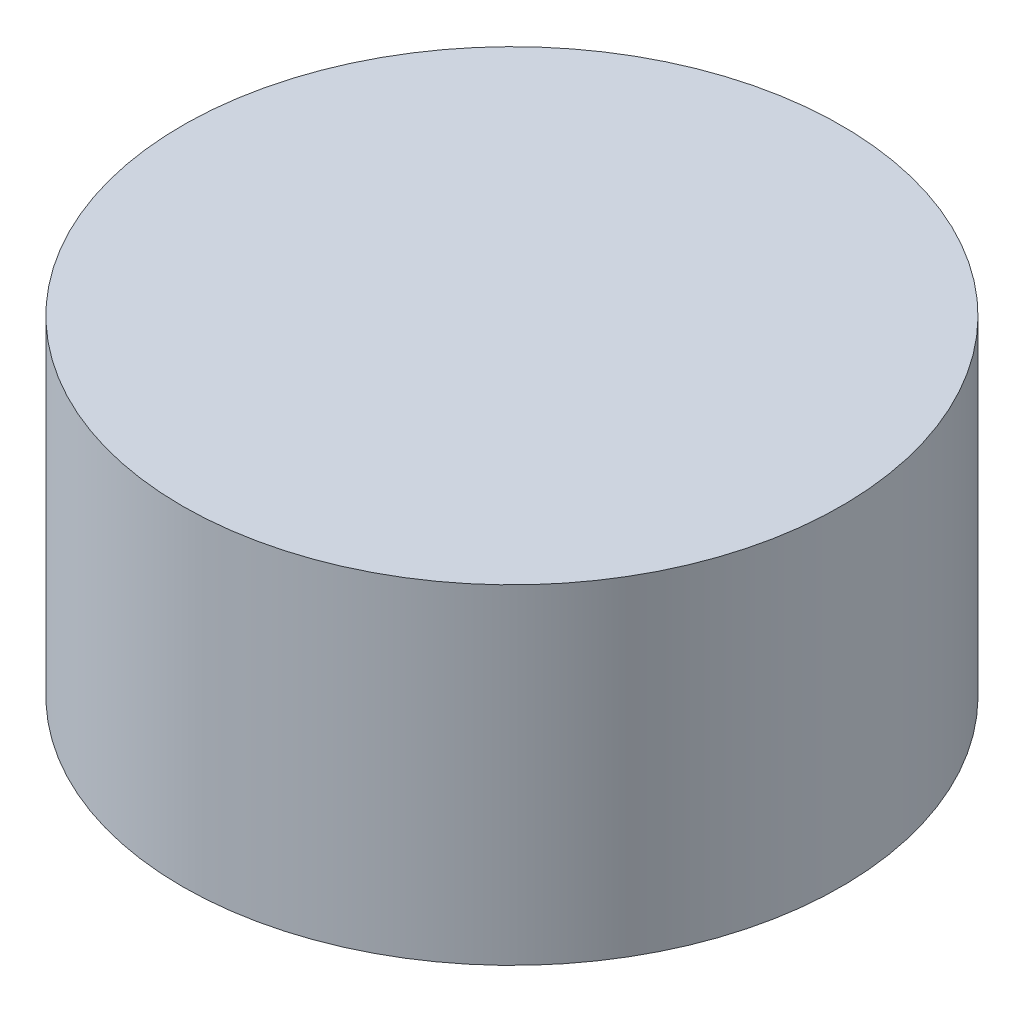
ISO-10303-21;
HEADER;
FILE_DESCRIPTION(('STEP AP214'),'2;1');
FILE_NAME('part.step','',(''),(''),'','','');
FILE_SCHEMA(('AUTOMOTIVE_DESIGN { 1 0 10303 214 1 1 1 1 }'));
ENDSEC;
DATA;
#1=APPLICATION_CONTEXT('core data for automotive mechanical design processes');
#2=APPLICATION_PROTOCOL_DEFINITION('international standard','automotive_design',2000,#1);
#3=PRODUCT_CONTEXT('',#1,'mechanical');
#4=PRODUCT('Part','Part','',(#3));
#5=PRODUCT_RELATED_PRODUCT_CATEGORY('part','',(#4));
#6=PRODUCT_DEFINITION_FORMATION('','',#4);
#7=PRODUCT_DEFINITION_CONTEXT('part definition',#1,'design');
#8=PRODUCT_DEFINITION('design','',#6,#7);
#9=PRODUCT_DEFINITION_SHAPE('','',#8);
#10=(LENGTH_UNIT() NAMED_UNIT(*) SI_UNIT(.MILLI.,.METRE.));
#11=(NAMED_UNIT(*) PLANE_ANGLE_UNIT() SI_UNIT($,.RADIAN.));
#12=(NAMED_UNIT(*) SI_UNIT($,.STERADIAN.) SOLID_ANGLE_UNIT());
#13=UNCERTAINTY_MEASURE_WITH_UNIT(LENGTH_MEASURE(1.E-05),#10,'distance_accuracy_value','');
#14=(GEOMETRIC_REPRESENTATION_CONTEXT(3) GLOBAL_UNCERTAINTY_ASSIGNED_CONTEXT((#13)) GLOBAL_UNIT_ASSIGNED_CONTEXT((#10,
#11,#12)) REPRESENTATION_CONTEXT('',''));
#15=CARTESIAN_POINT('',(0.,0.,0.));
#16=DIRECTION('',(0.,0.,1.));
#17=DIRECTION('',(1.,0.,0.));
#18=AXIS2_PLACEMENT_3D('',#15,#16,#17);
#19=CARTESIAN_POINT('',(0.,2.,0.));
#20=DIRECTION('',(0.,-1.,0.));
#21=DIRECTION('',(0.,0.,-1.));
#22=AXIS2_PLACEMENT_3D('',#19,#20,#21);
#23=CYLINDRICAL_SURFACE('',#22,4.);
#24=CARTESIAN_POINT('',(0.,2.,0.));
#25=DIRECTION('',(0.,1.,0.));
#26=DIRECTION('',(0.,0.,1.));
#27=AXIS2_PLACEMENT_3D('',#24,#25,#26);
#28=CIRCLE('',#27,4.);
#29=CARTESIAN_POINT('',(0.,2.,4.));
#30=VERTEX_POINT('',#29);
#31=EDGE_CURVE('E10',#30,#30,#28,.T.);
#32=ORIENTED_EDGE('',*,*,#31,.F.);
#33=EDGE_LOOP('',(#32));
#34=FACE_BOUND('',#33,.T.);
#35=CARTESIAN_POINT('',(0.,-2.,0.));
#36=DIRECTION('',(0.,1.,0.));
#37=DIRECTION('',(0.,0.,1.));
#38=AXIS2_PLACEMENT_3D('',#35,#36,#37);
#39=CIRCLE('',#38,4.);
#40=CARTESIAN_POINT('',(0.,-2.,4.));
#41=VERTEX_POINT('',#40);
#42=EDGE_CURVE('E37',#41,#41,#39,.T.);
#43=ORIENTED_EDGE('',*,*,#42,.T.);
#44=EDGE_LOOP('',(#43));
#45=FACE_BOUND('',#44,.T.);
#46=ADVANCED_FACE('F40',(#34,#45),#23,.T.);
#47=CARTESIAN_POINT('',(0.,2.,0.));
#48=DIRECTION('',(0.,1.,0.));
#49=DIRECTION('',(0.,0.,1.));
#50=AXIS2_PLACEMENT_3D('',#47,#48,#49);
#51=PLANE('',#50);
#52=ORIENTED_EDGE('',*,*,#31,.T.);
#53=EDGE_LOOP('',(#52));
#54=FACE_BOUND('',#53,.T.);
#55=ADVANCED_FACE('F55',(#54),#51,.T.);
#56=CARTESIAN_POINT('',(0.,-2.,0.));
#57=DIRECTION('',(0.,1.,0.));
#58=DIRECTION('',(0.,0.,1.));
#59=AXIS2_PLACEMENT_3D('',#56,#57,#58);
#60=PLANE('',#59);
#61=ORIENTED_EDGE('',*,*,#42,.F.);
#62=EDGE_LOOP('',(#61));
#63=FACE_BOUND('',#62,.T.);
#64=ADVANCED_FACE('F49',(#63),#60,.F.);
#65=CLOSED_SHELL('',(#46,#55,#64));
#66=MANIFOLD_SOLID_BREP('B2',#65);
#67=ADVANCED_BREP_SHAPE_REPRESENTATION('',(#18,#66),#14);
#68=SHAPE_DEFINITION_REPRESENTATION(#9,#67);
ENDSEC;
END-ISO-10303-21;
